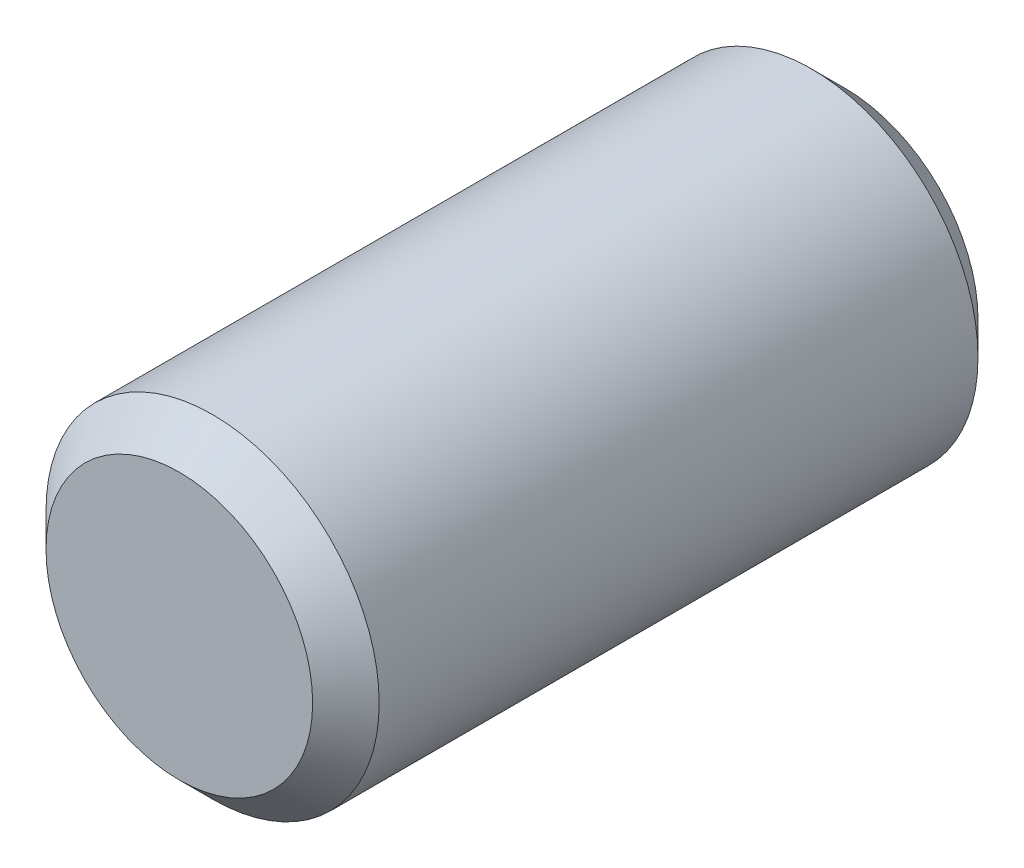
ISO-10303-21;
HEADER;
FILE_DESCRIPTION(('STEP AP214'),'2;1');
FILE_NAME('part.step','',(''),(''),'','','');
FILE_SCHEMA(('AUTOMOTIVE_DESIGN { 1 0 10303 214 1 1 1 1 }'));
ENDSEC;
DATA;
#1=APPLICATION_CONTEXT('core data for automotive mechanical design processes');
#2=APPLICATION_PROTOCOL_DEFINITION('international standard','automotive_design',2000,#1);
#3=PRODUCT_CONTEXT('',#1,'mechanical');
#4=PRODUCT('Part','Part','',(#3));
#5=PRODUCT_RELATED_PRODUCT_CATEGORY('part','',(#4));
#6=PRODUCT_DEFINITION_FORMATION('','',#4);
#7=PRODUCT_DEFINITION_CONTEXT('part definition',#1,'design');
#8=PRODUCT_DEFINITION('design','',#6,#7);
#9=PRODUCT_DEFINITION_SHAPE('','',#8);
#10=(LENGTH_UNIT() NAMED_UNIT(*) SI_UNIT(.MILLI.,.METRE.));
#11=(NAMED_UNIT(*) PLANE_ANGLE_UNIT() SI_UNIT($,.RADIAN.));
#12=(NAMED_UNIT(*) SI_UNIT($,.STERADIAN.) SOLID_ANGLE_UNIT());
#13=UNCERTAINTY_MEASURE_WITH_UNIT(LENGTH_MEASURE(1.E-05),#10,'distance_accuracy_value','');
#14=(GEOMETRIC_REPRESENTATION_CONTEXT(3) GLOBAL_UNCERTAINTY_ASSIGNED_CONTEXT((#13)) GLOBAL_UNIT_ASSIGNED_CONTEXT((#10,
#11,#12)) REPRESENTATION_CONTEXT('',''));
#15=CARTESIAN_POINT('',(0.,0.,0.));
#16=DIRECTION('',(0.,0.,1.));
#17=DIRECTION('',(1.,0.,0.));
#18=AXIS2_PLACEMENT_3D('',#15,#16,#17);
#19=CARTESIAN_POINT('',(0.,0.,0.));
#20=DIRECTION('',(0.,0.,-1.));
#21=DIRECTION('',(-1.,0.,0.));
#22=AXIS2_PLACEMENT_3D('',#19,#20,#21);
#23=PLANE('',#22);
#24=CARTESIAN_POINT('',(0.,0.,0.));
#25=DIRECTION('',(0.,0.,-1.));
#26=DIRECTION('',(-1.,0.,0.));
#27=AXIS2_PLACEMENT_3D('',#24,#25,#26);
#28=CIRCLE('',#27,4.0075);
#29=CARTESIAN_POINT('',(-4.0075,0.,0.));
#30=VERTEX_POINT('',#29);
#31=EDGE_CURVE('E10',#30,#30,#28,.F.);
#32=ORIENTED_EDGE('',*,*,#31,.T.);
#33=EDGE_LOOP('',(#32));
#34=FACE_BOUND('',#33,.T.);
#35=ADVANCED_FACE('F41',(#34),#23,.F.);
#36=CARTESIAN_POINT('',(0.,0.,0.));
#37=DIRECTION('',(0.,0.,1.));
#38=DIRECTION('',(1.,0.,0.));
#39=AXIS2_PLACEMENT_3D('',#36,#37,#38);
#40=CYLINDRICAL_SURFACE('',#39,5.0075);
#41=CARTESIAN_POINT('',(0.,0.,-19.));
#42=DIRECTION('',(0.,0.,1.));
#43=DIRECTION('',(1.,0.,0.));
#44=AXIS2_PLACEMENT_3D('',#41,#42,#43);
#45=CIRCLE('',#44,5.0075);
#46=CARTESIAN_POINT('',(5.0075,0.,-19.));
#47=VERTEX_POINT('',#46);
#48=EDGE_CURVE('E55',#47,#47,#45,.T.);
#49=ORIENTED_EDGE('',*,*,#48,.T.);
#50=EDGE_LOOP('',(#49));
#51=FACE_BOUND('',#50,.T.);
#52=CARTESIAN_POINT('',(0.,0.,-1.));
#53=DIRECTION('',(0.,0.,-1.));
#54=DIRECTION('',(-1.,0.,0.));
#55=AXIS2_PLACEMENT_3D('',#52,#53,#54);
#56=CIRCLE('',#55,5.0075);
#57=CARTESIAN_POINT('',(-5.0075,0.,-1.));
#58=VERTEX_POINT('',#57);
#59=EDGE_CURVE('E61',#58,#58,#56,.T.);
#60=ORIENTED_EDGE('',*,*,#59,.T.);
#61=EDGE_LOOP('',(#60));
#62=FACE_BOUND('',#61,.T.);
#63=ADVANCED_FACE('F69',(#51,#62),#40,.T.);
#64=CARTESIAN_POINT('',(0.,5.0075,-20.));
#65=DIRECTION('',(0.,0.,1.));
#66=DIRECTION('',(1.,0.,0.));
#67=AXIS2_PLACEMENT_3D('',#64,#65,#66);
#68=PLANE('',#67);
#69=CARTESIAN_POINT('',(0.,0.,-20.));
#70=DIRECTION('',(0.,0.,1.));
#71=DIRECTION('',(1.,0.,0.));
#72=AXIS2_PLACEMENT_3D('',#69,#70,#71);
#73=CIRCLE('',#72,4.0075);
#74=CARTESIAN_POINT('',(4.0075,0.,-20.));
#75=VERTEX_POINT('',#74);
#76=EDGE_CURVE('E49',#75,#75,#73,.F.);
#77=ORIENTED_EDGE('',*,*,#76,.T.);
#78=EDGE_LOOP('',(#77));
#79=FACE_BOUND('',#78,.T.);
#80=ADVANCED_FACE('F77',(#79),#68,.F.);
#81=CARTESIAN_POINT('',(0.,0.,-19.));
#82=DIRECTION('',(0.,0.,1.));
#83=DIRECTION('',(1.,0.,0.));
#84=AXIS2_PLACEMENT_3D('',#81,#82,#83);
#85=CONICAL_SURFACE('',#84,5.0075,0.78539816339745);
#86=ORIENTED_EDGE('',*,*,#76,.F.);
#87=EDGE_LOOP('',(#86));
#88=FACE_BOUND('',#87,.T.);
#89=ORIENTED_EDGE('',*,*,#48,.F.);
#90=EDGE_LOOP('',(#89));
#91=FACE_BOUND('',#90,.T.);
#92=ADVANCED_FACE('F73',(#88,#91),#85,.T.);
#93=CARTESIAN_POINT('',(0.,0.,0.));
#94=DIRECTION('',(0.,0.,-1.));
#95=DIRECTION('',(-1.,0.,0.));
#96=AXIS2_PLACEMENT_3D('',#93,#94,#95);
#97=CONICAL_SURFACE('',#96,4.0075,0.785398163397447);
#98=ORIENTED_EDGE('',*,*,#59,.F.);
#99=EDGE_LOOP('',(#98));
#100=FACE_BOUND('',#99,.T.);
#101=ORIENTED_EDGE('',*,*,#31,.F.);
#102=EDGE_LOOP('',(#101));
#103=FACE_BOUND('',#102,.T.);
#104=ADVANCED_FACE('F43',(#100,#103),#97,.T.);
#105=CLOSED_SHELL('',(#35,#63,#80,#92,#104));
#106=MANIFOLD_SOLID_BREP('B2',#105);
#107=ADVANCED_BREP_SHAPE_REPRESENTATION('',(#18,#106),#14);
#108=SHAPE_DEFINITION_REPRESENTATION(#9,#107);
ENDSEC;
END-ISO-10303-21;
